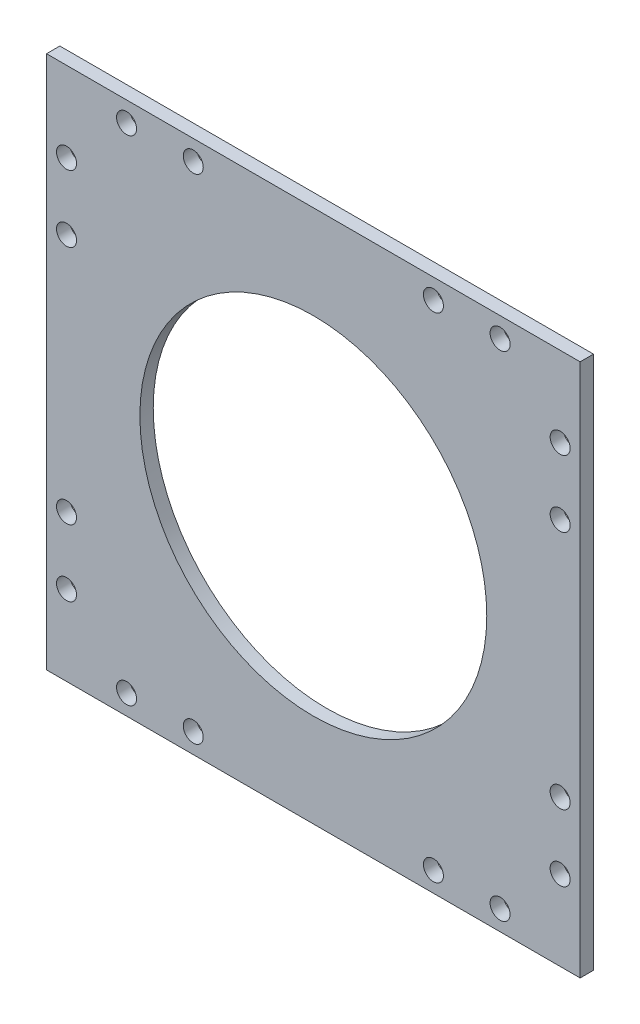
ISO-10303-21;
HEADER;
FILE_DESCRIPTION(('STEP AP214'),'2;1');
FILE_NAME('part.step','',(''),(''),'','','');
FILE_SCHEMA(('AUTOMOTIVE_DESIGN { 1 0 10303 214 1 1 1 1 }'));
ENDSEC;
DATA;
#1=APPLICATION_CONTEXT('core data for automotive mechanical design processes');
#2=APPLICATION_PROTOCOL_DEFINITION('international standard','automotive_design',2000,#1);
#3=PRODUCT_CONTEXT('',#1,'mechanical');
#4=PRODUCT('Part','Part','',(#3));
#5=PRODUCT_RELATED_PRODUCT_CATEGORY('part','',(#4));
#6=PRODUCT_DEFINITION_FORMATION('','',#4);
#7=PRODUCT_DEFINITION_CONTEXT('part definition',#1,'design');
#8=PRODUCT_DEFINITION('design','',#6,#7);
#9=PRODUCT_DEFINITION_SHAPE('','',#8);
#10=(LENGTH_UNIT() NAMED_UNIT(*) SI_UNIT(.MILLI.,.METRE.));
#11=(NAMED_UNIT(*) PLANE_ANGLE_UNIT() SI_UNIT($,.RADIAN.));
#12=(NAMED_UNIT(*) SI_UNIT($,.STERADIAN.) SOLID_ANGLE_UNIT());
#13=UNCERTAINTY_MEASURE_WITH_UNIT(LENGTH_MEASURE(1.E-05),#10,'distance_accuracy_value','');
#14=(GEOMETRIC_REPRESENTATION_CONTEXT(3) GLOBAL_UNCERTAINTY_ASSIGNED_CONTEXT((#13)) GLOBAL_UNIT_ASSIGNED_CONTEXT((#10,
#11,#12)) REPRESENTATION_CONTEXT('',''));
#15=CARTESIAN_POINT('',(0.,0.,0.));
#16=DIRECTION('',(0.,0.,1.));
#17=DIRECTION('',(1.,0.,0.));
#18=AXIS2_PLACEMENT_3D('',#15,#16,#17);
#19=CARTESIAN_POINT('',(0.,0.,2.));
#20=DIRECTION('',(0.,0.,1.));
#21=DIRECTION('',(1.,0.,0.));
#22=AXIS2_PLACEMENT_3D('',#19,#20,#21);
#23=PLANE('',#22);
#24=CARTESIAN_POINT('',(-28.,37.,2.));
#25=DIRECTION('',(0.,0.,1.));
#26=DIRECTION('',(1.,0.,0.));
#27=AXIS2_PLACEMENT_3D('',#24,#25,#26);
#28=CIRCLE('',#27,1.5);
#29=CARTESIAN_POINT('',(-26.5,37.,2.));
#30=VERTEX_POINT('',#29);
#31=EDGE_CURVE('E155',#30,#30,#28,.T.);
#32=ORIENTED_EDGE('',*,*,#31,.F.);
#33=EDGE_LOOP('',(#32));
#34=FACE_BOUND('',#33,.T.);
#35=CARTESIAN_POINT('',(-37.,28.,2.));
#36=DIRECTION('',(0.,0.,1.));
#37=DIRECTION('',(-1.,0.,0.));
#38=AXIS2_PLACEMENT_3D('',#35,#36,#37);
#39=CIRCLE('',#38,1.5);
#40=CARTESIAN_POINT('',(-38.5,28.,2.));
#41=VERTEX_POINT('',#40);
#42=EDGE_CURVE('E162',#41,#41,#39,.T.);
#43=ORIENTED_EDGE('',*,*,#42,.F.);
#44=EDGE_LOOP('',(#43));
#45=FACE_BOUND('',#44,.T.);
#46=CARTESIAN_POINT('',(-37.,18.,2.));
#47=DIRECTION('',(0.,0.,1.));
#48=DIRECTION('',(-1.,0.,0.));
#49=AXIS2_PLACEMENT_3D('',#46,#47,#48);
#50=CIRCLE('',#49,1.5);
#51=CARTESIAN_POINT('',(-38.5,18.,2.));
#52=VERTEX_POINT('',#51);
#53=EDGE_CURVE('E168',#52,#52,#50,.T.);
#54=ORIENTED_EDGE('',*,*,#53,.F.);
#55=EDGE_LOOP('',(#54));
#56=FACE_BOUND('',#55,.T.);
#57=CARTESIAN_POINT('',(-37.,-18.,2.));
#58=DIRECTION('',(0.,0.,1.));
#59=DIRECTION('',(-1.,0.,0.));
#60=AXIS2_PLACEMENT_3D('',#57,#58,#59);
#61=CIRCLE('',#60,1.5);
#62=CARTESIAN_POINT('',(-38.5,-18.,2.));
#63=VERTEX_POINT('',#62);
#64=EDGE_CURVE('E132',#63,#63,#61,.T.);
#65=ORIENTED_EDGE('',*,*,#64,.F.);
#66=EDGE_LOOP('',(#65));
#67=FACE_BOUND('',#66,.T.);
#68=CARTESIAN_POINT('',(-37.,-28.,2.));
#69=DIRECTION('',(0.,0.,1.));
#70=DIRECTION('',(-1.,0.,0.));
#71=AXIS2_PLACEMENT_3D('',#68,#69,#70);
#72=CIRCLE('',#71,1.5);
#73=CARTESIAN_POINT('',(-38.5,-28.,2.));
#74=VERTEX_POINT('',#73);
#75=EDGE_CURVE('E131',#74,#74,#72,.T.);
#76=ORIENTED_EDGE('',*,*,#75,.F.);
#77=EDGE_LOOP('',(#76));
#78=FACE_BOUND('',#77,.T.);
#79=CARTESIAN_POINT('',(37.,-28.,2.));
#80=DIRECTION('',(0.,0.,1.));
#81=DIRECTION('',(1.,0.,0.));
#82=AXIS2_PLACEMENT_3D('',#79,#80,#81);
#83=CIRCLE('',#82,1.5);
#84=CARTESIAN_POINT('',(38.5,-28.,2.));
#85=VERTEX_POINT('',#84);
#86=EDGE_CURVE('E138',#85,#85,#83,.T.);
#87=ORIENTED_EDGE('',*,*,#86,.F.);
#88=EDGE_LOOP('',(#87));
#89=FACE_BOUND('',#88,.T.);
#90=CARTESIAN_POINT('',(37.,-18.,2.));
#91=DIRECTION('',(0.,0.,1.));
#92=DIRECTION('',(1.,0.,0.));
#93=AXIS2_PLACEMENT_3D('',#90,#91,#92);
#94=CIRCLE('',#93,1.5);
#95=CARTESIAN_POINT('',(38.5,-18.,2.));
#96=VERTEX_POINT('',#95);
#97=EDGE_CURVE('E144',#96,#96,#94,.T.);
#98=ORIENTED_EDGE('',*,*,#97,.F.);
#99=EDGE_LOOP('',(#98));
#100=FACE_BOUND('',#99,.T.);
#101=CARTESIAN_POINT('',(37.,18.,2.));
#102=DIRECTION('',(0.,0.,1.));
#103=DIRECTION('',(1.,0.,0.));
#104=AXIS2_PLACEMENT_3D('',#101,#102,#103);
#105=CIRCLE('',#104,1.5);
#106=CARTESIAN_POINT('',(38.5,18.,2.));
#107=VERTEX_POINT('',#106);
#108=EDGE_CURVE('E125',#107,#107,#105,.T.);
#109=ORIENTED_EDGE('',*,*,#108,.F.);
#110=EDGE_LOOP('',(#109));
#111=FACE_BOUND('',#110,.T.);
#112=CARTESIAN_POINT('',(-28.,-37.,2.));
#113=DIRECTION('',(0.,0.,1.));
#114=DIRECTION('',(-1.,0.,0.));
#115=AXIS2_PLACEMENT_3D('',#112,#113,#114);
#116=CIRCLE('',#115,1.5);
#117=CARTESIAN_POINT('',(-29.5,-37.,2.));
#118=VERTEX_POINT('',#117);
#119=EDGE_CURVE('E203',#118,#118,#116,.T.);
#120=ORIENTED_EDGE('',*,*,#119,.F.);
#121=EDGE_LOOP('',(#120));
#122=FACE_BOUND('',#121,.T.);
#123=CARTESIAN_POINT('',(-18.,-37.,2.));
#124=DIRECTION('',(0.,0.,1.));
#125=DIRECTION('',(-1.,0.,0.));
#126=AXIS2_PLACEMENT_3D('',#123,#124,#125);
#127=CIRCLE('',#126,1.5);
#128=CARTESIAN_POINT('',(-19.5,-37.,2.));
#129=VERTEX_POINT('',#128);
#130=EDGE_CURVE('E209',#129,#129,#127,.T.);
#131=ORIENTED_EDGE('',*,*,#130,.F.);
#132=EDGE_LOOP('',(#131));
#133=FACE_BOUND('',#132,.T.);
#134=CARTESIAN_POINT('',(18.,-37.,2.));
#135=DIRECTION('',(0.,0.,1.));
#136=DIRECTION('',(-1.,0.,0.));
#137=AXIS2_PLACEMENT_3D('',#134,#135,#136);
#138=CIRCLE('',#137,1.49999999999999);
#139=CARTESIAN_POINT('',(16.5,-37.,2.));
#140=VERTEX_POINT('',#139);
#141=EDGE_CURVE('E180',#140,#140,#138,.T.);
#142=ORIENTED_EDGE('',*,*,#141,.F.);
#143=EDGE_LOOP('',(#142));
#144=FACE_BOUND('',#143,.T.);
#145=CARTESIAN_POINT('',(28.,-37.,2.));
#146=DIRECTION('',(0.,0.,1.));
#147=DIRECTION('',(-1.,0.,0.));
#148=AXIS2_PLACEMENT_3D('',#145,#146,#147);
#149=CIRCLE('',#148,1.5);
#150=CARTESIAN_POINT('',(26.5,-37.,2.));
#151=VERTEX_POINT('',#150);
#152=EDGE_CURVE('E179',#151,#151,#149,.T.);
#153=ORIENTED_EDGE('',*,*,#152,.F.);
#154=EDGE_LOOP('',(#153));
#155=FACE_BOUND('',#154,.T.);
#156=CARTESIAN_POINT('',(28.,37.,2.));
#157=DIRECTION('',(0.,0.,1.));
#158=DIRECTION('',(1.,0.,0.));
#159=AXIS2_PLACEMENT_3D('',#156,#157,#158);
#160=CIRCLE('',#159,1.5);
#161=CARTESIAN_POINT('',(29.5,37.,2.));
#162=VERTEX_POINT('',#161);
#163=EDGE_CURVE('E186',#162,#162,#160,.T.);
#164=ORIENTED_EDGE('',*,*,#163,.F.);
#165=EDGE_LOOP('',(#164));
#166=FACE_BOUND('',#165,.T.);
#167=CARTESIAN_POINT('',(18.,37.,2.));
#168=DIRECTION('',(0.,0.,1.));
#169=DIRECTION('',(1.,0.,0.));
#170=AXIS2_PLACEMENT_3D('',#167,#168,#169);
#171=CIRCLE('',#170,1.49999999999999);
#172=CARTESIAN_POINT('',(19.5,37.,2.));
#173=VERTEX_POINT('',#172);
#174=EDGE_CURVE('E192',#173,#173,#171,.T.);
#175=ORIENTED_EDGE('',*,*,#174,.F.);
#176=EDGE_LOOP('',(#175));
#177=FACE_BOUND('',#176,.T.);
#178=CARTESIAN_POINT('',(-18.,37.,2.));
#179=DIRECTION('',(0.,0.,1.));
#180=DIRECTION('',(1.,0.,0.));
#181=AXIS2_PLACEMENT_3D('',#178,#179,#180);
#182=CIRCLE('',#181,1.5);
#183=CARTESIAN_POINT('',(-16.5,37.,2.));
#184=VERTEX_POINT('',#183);
#185=EDGE_CURVE('E156',#184,#184,#182,.T.);
#186=ORIENTED_EDGE('',*,*,#185,.F.);
#187=EDGE_LOOP('',(#186));
#188=FACE_BOUND('',#187,.T.);
#189=CARTESIAN_POINT('',(37.,28.,2.));
#190=DIRECTION('',(0.,0.,1.));
#191=DIRECTION('',(1.,0.,0.));
#192=AXIS2_PLACEMENT_3D('',#189,#190,#191);
#193=CIRCLE('',#192,1.5);
#194=CARTESIAN_POINT('',(38.5,28.,2.));
#195=VERTEX_POINT('',#194);
#196=EDGE_CURVE('E122',#195,#195,#193,.T.);
#197=ORIENTED_EDGE('',*,*,#196,.F.);
#198=EDGE_LOOP('',(#197));
#199=FACE_BOUND('',#198,.T.);
#200=DIRECTION('',(0.,1.,0.));
#201=VECTOR('',#200,1.);
#202=CARTESIAN_POINT('',(40.,40.,2.));
#203=LINE('',#202,#201);
#204=CARTESIAN_POINT('',(40.,-40.,2.));
#205=VERTEX_POINT('',#204);
#206=CARTESIAN_POINT('',(40.,40.,2.));
#207=VERTEX_POINT('',#206);
#208=EDGE_CURVE('E89',#205,#207,#203,.T.);
#209=ORIENTED_EDGE('',*,*,#208,.T.);
#210=DIRECTION('',(-1.,0.,0.));
#211=VECTOR('',#210,1.);
#212=CARTESIAN_POINT('',(-40.,40.,2.));
#213=LINE('',#212,#211);
#214=CARTESIAN_POINT('',(-40.,40.,2.));
#215=VERTEX_POINT('',#214);
#216=EDGE_CURVE('E84',#207,#215,#213,.T.);
#217=ORIENTED_EDGE('',*,*,#216,.T.);
#218=DIRECTION('',(0.,-1.,0.));
#219=VECTOR('',#218,1.);
#220=CARTESIAN_POINT('',(-40.,40.,2.));
#221=LINE('',#220,#219);
#222=CARTESIAN_POINT('',(-40.,-40.,2.));
#223=VERTEX_POINT('',#222);
#224=EDGE_CURVE('E87',#215,#223,#221,.T.);
#225=ORIENTED_EDGE('',*,*,#224,.T.);
#226=DIRECTION('',(1.,0.,0.));
#227=VECTOR('',#226,1.);
#228=CARTESIAN_POINT('',(-40.,-40.,2.));
#229=LINE('',#228,#227);
#230=EDGE_CURVE('E54',#223,#205,#229,.T.);
#231=ORIENTED_EDGE('',*,*,#230,.T.);
#232=EDGE_LOOP('',(#209,#217,#225,#231));
#233=FACE_BOUND('',#232,.T.);
#234=CARTESIAN_POINT('',(0.,0.,2.));
#235=DIRECTION('',(0.,0.,1.));
#236=DIRECTION('',(1.,0.,0.));
#237=AXIS2_PLACEMENT_3D('',#234,#235,#236);
#238=CIRCLE('',#237,26.);
#239=CARTESIAN_POINT('',(26.,0.,2.));
#240=VERTEX_POINT('',#239);
#241=EDGE_CURVE('E104',#240,#240,#238,.T.);
#242=ORIENTED_EDGE('',*,*,#241,.F.);
#243=EDGE_LOOP('',(#242));
#244=FACE_BOUND('',#243,.T.);
#245=ADVANCED_FACE('F37',(#34,#45,#56,#67,#78,#89,#100,#111,#122,#133,#144,#155,#166,#177,#188,
#199,#233,#244),#23,.T.);
#246=CARTESIAN_POINT('',(0.,0.,0.));
#247=DIRECTION('',(0.,0.,1.));
#248=DIRECTION('',(1.,0.,0.));
#249=AXIS2_PLACEMENT_3D('',#246,#247,#248);
#250=PLANE('',#249);
#251=CARTESIAN_POINT('',(-28.,37.,0.));
#252=DIRECTION('',(0.,0.,1.));
#253=DIRECTION('',(1.,0.,0.));
#254=AXIS2_PLACEMENT_3D('',#251,#252,#253);
#255=CIRCLE('',#254,1.5);
#256=CARTESIAN_POINT('',(-26.5,37.,0.));
#257=VERTEX_POINT('',#256);
#258=EDGE_CURVE('E152',#257,#257,#255,.T.);
#259=ORIENTED_EDGE('',*,*,#258,.T.);
#260=EDGE_LOOP('',(#259));
#261=FACE_BOUND('',#260,.T.);
#262=CARTESIAN_POINT('',(-37.,28.,0.));
#263=DIRECTION('',(0.,0.,1.));
#264=DIRECTION('',(-1.,0.,0.));
#265=AXIS2_PLACEMENT_3D('',#262,#263,#264);
#266=CIRCLE('',#265,1.5);
#267=CARTESIAN_POINT('',(-38.5,28.,0.));
#268=VERTEX_POINT('',#267);
#269=EDGE_CURVE('E159',#268,#268,#266,.T.);
#270=ORIENTED_EDGE('',*,*,#269,.T.);
#271=EDGE_LOOP('',(#270));
#272=FACE_BOUND('',#271,.T.);
#273=CARTESIAN_POINT('',(-37.,18.,0.));
#274=DIRECTION('',(0.,0.,1.));
#275=DIRECTION('',(-1.,0.,0.));
#276=AXIS2_PLACEMENT_3D('',#273,#274,#275);
#277=CIRCLE('',#276,1.5);
#278=CARTESIAN_POINT('',(-38.5,18.,0.));
#279=VERTEX_POINT('',#278);
#280=EDGE_CURVE('E165',#279,#279,#277,.T.);
#281=ORIENTED_EDGE('',*,*,#280,.T.);
#282=EDGE_LOOP('',(#281));
#283=FACE_BOUND('',#282,.T.);
#284=CARTESIAN_POINT('',(-37.,-18.,0.));
#285=DIRECTION('',(0.,0.,1.));
#286=DIRECTION('',(-1.,0.,0.));
#287=AXIS2_PLACEMENT_3D('',#284,#285,#286);
#288=CIRCLE('',#287,1.5);
#289=CARTESIAN_POINT('',(-38.5,-18.,0.));
#290=VERTEX_POINT('',#289);
#291=EDGE_CURVE('E171',#290,#290,#288,.T.);
#292=ORIENTED_EDGE('',*,*,#291,.T.);
#293=EDGE_LOOP('',(#292));
#294=FACE_BOUND('',#293,.T.);
#295=CARTESIAN_POINT('',(-37.,-28.,0.));
#296=DIRECTION('',(0.,0.,1.));
#297=DIRECTION('',(-1.,0.,0.));
#298=AXIS2_PLACEMENT_3D('',#295,#296,#297);
#299=CIRCLE('',#298,1.5);
#300=CARTESIAN_POINT('',(-38.5,-28.,0.));
#301=VERTEX_POINT('',#300);
#302=EDGE_CURVE('E128',#301,#301,#299,.T.);
#303=ORIENTED_EDGE('',*,*,#302,.T.);
#304=EDGE_LOOP('',(#303));
#305=FACE_BOUND('',#304,.T.);
#306=CARTESIAN_POINT('',(37.,-28.,0.));
#307=DIRECTION('',(0.,0.,1.));
#308=DIRECTION('',(1.,0.,0.));
#309=AXIS2_PLACEMENT_3D('',#306,#307,#308);
#310=CIRCLE('',#309,1.5);
#311=CARTESIAN_POINT('',(38.5,-28.,0.));
#312=VERTEX_POINT('',#311);
#313=EDGE_CURVE('E135',#312,#312,#310,.T.);
#314=ORIENTED_EDGE('',*,*,#313,.T.);
#315=EDGE_LOOP('',(#314));
#316=FACE_BOUND('',#315,.T.);
#317=CARTESIAN_POINT('',(37.,-18.,0.));
#318=DIRECTION('',(0.,0.,1.));
#319=DIRECTION('',(1.,0.,0.));
#320=AXIS2_PLACEMENT_3D('',#317,#318,#319);
#321=CIRCLE('',#320,1.5);
#322=CARTESIAN_POINT('',(38.5,-18.,0.));
#323=VERTEX_POINT('',#322);
#324=EDGE_CURVE('E141',#323,#323,#321,.T.);
#325=ORIENTED_EDGE('',*,*,#324,.T.);
#326=EDGE_LOOP('',(#325));
#327=FACE_BOUND('',#326,.T.);
#328=CARTESIAN_POINT('',(37.,18.,0.));
#329=DIRECTION('',(0.,0.,1.));
#330=DIRECTION('',(1.,0.,0.));
#331=AXIS2_PLACEMENT_3D('',#328,#329,#330);
#332=CIRCLE('',#331,1.5);
#333=CARTESIAN_POINT('',(38.5,18.,0.));
#334=VERTEX_POINT('',#333);
#335=EDGE_CURVE('E147',#334,#334,#332,.T.);
#336=ORIENTED_EDGE('',*,*,#335,.T.);
#337=EDGE_LOOP('',(#336));
#338=FACE_BOUND('',#337,.T.);
#339=CARTESIAN_POINT('',(-28.,-37.,0.));
#340=DIRECTION('',(0.,0.,1.));
#341=DIRECTION('',(-1.,0.,0.));
#342=AXIS2_PLACEMENT_3D('',#339,#340,#341);
#343=CIRCLE('',#342,1.5);
#344=CARTESIAN_POINT('',(-29.5,-37.,0.));
#345=VERTEX_POINT('',#344);
#346=EDGE_CURVE('E200',#345,#345,#343,.T.);
#347=ORIENTED_EDGE('',*,*,#346,.T.);
#348=EDGE_LOOP('',(#347));
#349=FACE_BOUND('',#348,.T.);
#350=CARTESIAN_POINT('',(-18.,-37.,0.));
#351=DIRECTION('',(0.,0.,1.));
#352=DIRECTION('',(-1.,0.,0.));
#353=AXIS2_PLACEMENT_3D('',#350,#351,#352);
#354=CIRCLE('',#353,1.5);
#355=CARTESIAN_POINT('',(-19.5,-37.,0.));
#356=VERTEX_POINT('',#355);
#357=EDGE_CURVE('E206',#356,#356,#354,.T.);
#358=ORIENTED_EDGE('',*,*,#357,.T.);
#359=EDGE_LOOP('',(#358));
#360=FACE_BOUND('',#359,.T.);
#361=CARTESIAN_POINT('',(18.,-37.,0.));
#362=DIRECTION('',(0.,0.,1.));
#363=DIRECTION('',(-1.,0.,0.));
#364=AXIS2_PLACEMENT_3D('',#361,#362,#363);
#365=CIRCLE('',#364,1.49999999999999);
#366=CARTESIAN_POINT('',(16.5,-37.,0.));
#367=VERTEX_POINT('',#366);
#368=EDGE_CURVE('E212',#367,#367,#365,.T.);
#369=ORIENTED_EDGE('',*,*,#368,.T.);
#370=EDGE_LOOP('',(#369));
#371=FACE_BOUND('',#370,.T.);
#372=CARTESIAN_POINT('',(28.,-37.,0.));
#373=DIRECTION('',(0.,0.,1.));
#374=DIRECTION('',(-1.,0.,0.));
#375=AXIS2_PLACEMENT_3D('',#372,#373,#374);
#376=CIRCLE('',#375,1.5);
#377=CARTESIAN_POINT('',(26.5,-37.,0.));
#378=VERTEX_POINT('',#377);
#379=EDGE_CURVE('E176',#378,#378,#376,.T.);
#380=ORIENTED_EDGE('',*,*,#379,.T.);
#381=EDGE_LOOP('',(#380));
#382=FACE_BOUND('',#381,.T.);
#383=CARTESIAN_POINT('',(28.,37.,0.));
#384=DIRECTION('',(0.,0.,1.));
#385=DIRECTION('',(1.,0.,0.));
#386=AXIS2_PLACEMENT_3D('',#383,#384,#385);
#387=CIRCLE('',#386,1.5);
#388=CARTESIAN_POINT('',(29.5,37.,0.));
#389=VERTEX_POINT('',#388);
#390=EDGE_CURVE('E183',#389,#389,#387,.T.);
#391=ORIENTED_EDGE('',*,*,#390,.T.);
#392=EDGE_LOOP('',(#391));
#393=FACE_BOUND('',#392,.T.);
#394=CARTESIAN_POINT('',(18.,37.,0.));
#395=DIRECTION('',(0.,0.,1.));
#396=DIRECTION('',(1.,0.,0.));
#397=AXIS2_PLACEMENT_3D('',#394,#395,#396);
#398=CIRCLE('',#397,1.49999999999999);
#399=CARTESIAN_POINT('',(19.5,37.,0.));
#400=VERTEX_POINT('',#399);
#401=EDGE_CURVE('E189',#400,#400,#398,.T.);
#402=ORIENTED_EDGE('',*,*,#401,.T.);
#403=EDGE_LOOP('',(#402));
#404=FACE_BOUND('',#403,.T.);
#405=CARTESIAN_POINT('',(-18.,37.,0.));
#406=DIRECTION('',(0.,0.,1.));
#407=DIRECTION('',(1.,0.,0.));
#408=AXIS2_PLACEMENT_3D('',#405,#406,#407);
#409=CIRCLE('',#408,1.5);
#410=CARTESIAN_POINT('',(-16.5,37.,0.));
#411=VERTEX_POINT('',#410);
#412=EDGE_CURVE('E195',#411,#411,#409,.T.);
#413=ORIENTED_EDGE('',*,*,#412,.T.);
#414=EDGE_LOOP('',(#413));
#415=FACE_BOUND('',#414,.T.);
#416=CARTESIAN_POINT('',(37.,28.,0.));
#417=DIRECTION('',(0.,0.,1.));
#418=DIRECTION('',(1.,0.,0.));
#419=AXIS2_PLACEMENT_3D('',#416,#417,#418);
#420=CIRCLE('',#419,1.5);
#421=CARTESIAN_POINT('',(38.5,28.,0.));
#422=VERTEX_POINT('',#421);
#423=EDGE_CURVE('E119',#422,#422,#420,.T.);
#424=ORIENTED_EDGE('',*,*,#423,.T.);
#425=EDGE_LOOP('',(#424));
#426=FACE_BOUND('',#425,.T.);
#427=DIRECTION('',(0.,1.,0.));
#428=VECTOR('',#427,1.);
#429=CARTESIAN_POINT('',(40.,40.,0.));
#430=LINE('',#429,#428);
#431=CARTESIAN_POINT('',(40.,-40.,0.));
#432=VERTEX_POINT('',#431);
#433=CARTESIAN_POINT('',(40.,40.,0.));
#434=VERTEX_POINT('',#433);
#435=EDGE_CURVE('E101',#432,#434,#430,.T.);
#436=ORIENTED_EDGE('',*,*,#435,.F.);
#437=DIRECTION('',(1.,0.,0.));
#438=VECTOR('',#437,1.);
#439=CARTESIAN_POINT('',(-40.,-40.,0.));
#440=LINE('',#439,#438);
#441=CARTESIAN_POINT('',(-40.,-40.,0.));
#442=VERTEX_POINT('',#441);
#443=EDGE_CURVE('E77',#442,#432,#440,.T.);
#444=ORIENTED_EDGE('',*,*,#443,.F.);
#445=DIRECTION('',(0.,-1.,0.));
#446=VECTOR('',#445,1.);
#447=CARTESIAN_POINT('',(-40.,40.,0.));
#448=LINE('',#447,#446);
#449=CARTESIAN_POINT('',(-40.,40.,0.));
#450=VERTEX_POINT('',#449);
#451=EDGE_CURVE('E71',#450,#442,#448,.T.);
#452=ORIENTED_EDGE('',*,*,#451,.F.);
#453=DIRECTION('',(-1.,0.,0.));
#454=VECTOR('',#453,1.);
#455=CARTESIAN_POINT('',(-40.,40.,0.));
#456=LINE('',#455,#454);
#457=EDGE_CURVE('E93',#434,#450,#456,.T.);
#458=ORIENTED_EDGE('',*,*,#457,.F.);
#459=EDGE_LOOP('',(#436,#444,#452,#458));
#460=FACE_BOUND('',#459,.T.);
#461=CARTESIAN_POINT('',(0.,0.,0.));
#462=DIRECTION('',(0.,0.,1.));
#463=DIRECTION('',(1.,0.,0.));
#464=AXIS2_PLACEMENT_3D('',#461,#462,#463);
#465=CIRCLE('',#464,26.);
#466=CARTESIAN_POINT('',(26.,0.,0.));
#467=VERTEX_POINT('',#466);
#468=EDGE_CURVE('E116',#467,#467,#465,.T.);
#469=ORIENTED_EDGE('',*,*,#468,.T.);
#470=EDGE_LOOP('',(#469));
#471=FACE_BOUND('',#470,.T.);
#472=ADVANCED_FACE('F112',(#261,#272,#283,#294,#305,#316,#327,#338,#349,#360,#371,#382,#393,
#404,#415,#426,#460,#471),#250,.F.);
#473=CARTESIAN_POINT('',(40.,40.,2.));
#474=DIRECTION('',(-1.,0.,0.));
#475=DIRECTION('',(0.,-1.,0.));
#476=AXIS2_PLACEMENT_3D('',#473,#474,#475);
#477=PLANE('',#476);
#478=ORIENTED_EDGE('',*,*,#435,.T.);
#479=DIRECTION('',(0.,0.,-1.));
#480=VECTOR('',#479,1.);
#481=CARTESIAN_POINT('',(40.,40.,2.));
#482=LINE('',#481,#480);
#483=EDGE_CURVE('E11',#207,#434,#482,.T.);
#484=ORIENTED_EDGE('',*,*,#483,.F.);
#485=ORIENTED_EDGE('',*,*,#208,.F.);
#486=DIRECTION('',(0.,0.,-1.));
#487=VECTOR('',#486,1.);
#488=CARTESIAN_POINT('',(40.,-40.,2.));
#489=LINE('',#488,#487);
#490=EDGE_CURVE('E97',#205,#432,#489,.T.);
#491=ORIENTED_EDGE('',*,*,#490,.T.);
#492=EDGE_LOOP('',(#478,#484,#485,#491));
#493=FACE_BOUND('',#492,.T.);
#494=ADVANCED_FACE('F39',(#493),#477,.F.);
#495=CARTESIAN_POINT('',(-40.,40.,2.));
#496=DIRECTION('',(0.,-1.,0.));
#497=DIRECTION('',(0.,0.,-1.));
#498=AXIS2_PLACEMENT_3D('',#495,#496,#497);
#499=PLANE('',#498);
#500=ORIENTED_EDGE('',*,*,#457,.T.);
#501=DIRECTION('',(0.,0.,-1.));
#502=VECTOR('',#501,1.);
#503=CARTESIAN_POINT('',(-40.,40.,2.));
#504=LINE('',#503,#502);
#505=EDGE_CURVE('E46',#215,#450,#504,.T.);
#506=ORIENTED_EDGE('',*,*,#505,.F.);
#507=ORIENTED_EDGE('',*,*,#216,.F.);
#508=ORIENTED_EDGE('',*,*,#483,.T.);
#509=EDGE_LOOP('',(#500,#506,#507,#508));
#510=FACE_BOUND('',#509,.T.);
#511=ADVANCED_FACE('F92',(#510),#499,.F.);
#512=CARTESIAN_POINT('',(-40.,40.,2.));
#513=DIRECTION('',(1.,0.,0.));
#514=DIRECTION('',(0.,1.,0.));
#515=AXIS2_PLACEMENT_3D('',#512,#513,#514);
#516=PLANE('',#515);
#517=ORIENTED_EDGE('',*,*,#451,.T.);
#518=DIRECTION('',(0.,0.,-1.));
#519=VECTOR('',#518,1.);
#520=CARTESIAN_POINT('',(-40.,-40.,2.));
#521=LINE('',#520,#519);
#522=EDGE_CURVE('E94',#223,#442,#521,.T.);
#523=ORIENTED_EDGE('',*,*,#522,.F.);
#524=ORIENTED_EDGE('',*,*,#224,.F.);
#525=ORIENTED_EDGE('',*,*,#505,.T.);
#526=EDGE_LOOP('',(#517,#523,#524,#525));
#527=FACE_BOUND('',#526,.T.);
#528=ADVANCED_FACE('F95',(#527),#516,.F.);
#529=CARTESIAN_POINT('',(-40.,-40.,2.));
#530=DIRECTION('',(0.,1.,0.));
#531=DIRECTION('',(0.,0.,1.));
#532=AXIS2_PLACEMENT_3D('',#529,#530,#531);
#533=PLANE('',#532);
#534=ORIENTED_EDGE('',*,*,#443,.T.);
#535=ORIENTED_EDGE('',*,*,#490,.F.);
#536=ORIENTED_EDGE('',*,*,#230,.F.);
#537=ORIENTED_EDGE('',*,*,#522,.T.);
#538=EDGE_LOOP('',(#534,#535,#536,#537));
#539=FACE_BOUND('',#538,.T.);
#540=ADVANCED_FACE('F109',(#539),#533,.F.);
#541=CARTESIAN_POINT('',(0.,0.,2.));
#542=DIRECTION('',(0.,0.,-1.));
#543=DIRECTION('',(-1.,0.,0.));
#544=AXIS2_PLACEMENT_3D('',#541,#542,#543);
#545=CYLINDRICAL_SURFACE('',#544,26.);
#546=ORIENTED_EDGE('',*,*,#241,.T.);
#547=EDGE_LOOP('',(#546));
#548=FACE_BOUND('',#547,.T.);
#549=ORIENTED_EDGE('',*,*,#468,.F.);
#550=EDGE_LOOP('',(#549));
#551=FACE_BOUND('',#550,.T.);
#552=ADVANCED_FACE('F237',(#548,#551),#545,.F.);
#553=CARTESIAN_POINT('',(37.,28.,0.));
#554=DIRECTION('',(0.,0.,1.));
#555=DIRECTION('',(1.,0.,0.));
#556=AXIS2_PLACEMENT_3D('',#553,#554,#555);
#557=CYLINDRICAL_SURFACE('',#556,1.5);
#558=ORIENTED_EDGE('',*,*,#423,.F.);
#559=EDGE_LOOP('',(#558));
#560=FACE_BOUND('',#559,.T.);
#561=ORIENTED_EDGE('',*,*,#196,.T.);
#562=EDGE_LOOP('',(#561));
#563=FACE_BOUND('',#562,.T.);
#564=ADVANCED_FACE('F234',(#560,#563),#557,.F.);
#565=CARTESIAN_POINT('',(-18.,37.,0.));
#566=DIRECTION('',(0.,0.,1.));
#567=DIRECTION('',(1.,0.,0.));
#568=AXIS2_PLACEMENT_3D('',#565,#566,#567);
#569=CYLINDRICAL_SURFACE('',#568,1.5);
#570=ORIENTED_EDGE('',*,*,#412,.F.);
#571=EDGE_LOOP('',(#570));
#572=FACE_BOUND('',#571,.T.);
#573=ORIENTED_EDGE('',*,*,#185,.T.);
#574=EDGE_LOOP('',(#573));
#575=FACE_BOUND('',#574,.T.);
#576=ADVANCED_FACE('F236',(#572,#575),#569,.F.);
#577=CARTESIAN_POINT('',(18.,37.,0.));
#578=DIRECTION('',(0.,0.,1.));
#579=DIRECTION('',(1.,0.,0.));
#580=AXIS2_PLACEMENT_3D('',#577,#578,#579);
#581=CYLINDRICAL_SURFACE('',#580,1.49999999999999);
#582=ORIENTED_EDGE('',*,*,#401,.F.);
#583=EDGE_LOOP('',(#582));
#584=FACE_BOUND('',#583,.T.);
#585=ORIENTED_EDGE('',*,*,#174,.T.);
#586=EDGE_LOOP('',(#585));
#587=FACE_BOUND('',#586,.T.);
#588=ADVANCED_FACE('F244',(#584,#587),#581,.F.);
#589=CARTESIAN_POINT('',(28.,37.,0.));
#590=DIRECTION('',(0.,0.,1.));
#591=DIRECTION('',(1.,0.,0.));
#592=AXIS2_PLACEMENT_3D('',#589,#590,#591);
#593=CYLINDRICAL_SURFACE('',#592,1.5);
#594=ORIENTED_EDGE('',*,*,#390,.F.);
#595=EDGE_LOOP('',(#594));
#596=FACE_BOUND('',#595,.T.);
#597=ORIENTED_EDGE('',*,*,#163,.T.);
#598=EDGE_LOOP('',(#597));
#599=FACE_BOUND('',#598,.T.);
#600=ADVANCED_FACE('F334',(#596,#599),#593,.F.);
#601=CARTESIAN_POINT('',(28.,-37.,0.));
#602=DIRECTION('',(0.,0.,1.));
#603=DIRECTION('',(1.,0.,0.));
#604=AXIS2_PLACEMENT_3D('',#601,#602,#603);
#605=CYLINDRICAL_SURFACE('',#604,1.5);
#606=ORIENTED_EDGE('',*,*,#379,.F.);
#607=EDGE_LOOP('',(#606));
#608=FACE_BOUND('',#607,.T.);
#609=ORIENTED_EDGE('',*,*,#152,.T.);
#610=EDGE_LOOP('',(#609));
#611=FACE_BOUND('',#610,.T.);
#612=ADVANCED_FACE('F344',(#608,#611),#605,.F.);
#613=CARTESIAN_POINT('',(18.,-37.,0.));
#614=DIRECTION('',(0.,0.,1.));
#615=DIRECTION('',(1.,0.,0.));
#616=AXIS2_PLACEMENT_3D('',#613,#614,#615);
#617=CYLINDRICAL_SURFACE('',#616,1.49999999999999);
#618=ORIENTED_EDGE('',*,*,#368,.F.);
#619=EDGE_LOOP('',(#618));
#620=FACE_BOUND('',#619,.T.);
#621=ORIENTED_EDGE('',*,*,#141,.T.);
#622=EDGE_LOOP('',(#621));
#623=FACE_BOUND('',#622,.T.);
#624=ADVANCED_FACE('F218',(#620,#623),#617,.F.);
#625=CARTESIAN_POINT('',(-18.,-37.,0.));
#626=DIRECTION('',(0.,0.,1.));
#627=DIRECTION('',(1.,0.,0.));
#628=AXIS2_PLACEMENT_3D('',#625,#626,#627);
#629=CYLINDRICAL_SURFACE('',#628,1.5);
#630=ORIENTED_EDGE('',*,*,#357,.F.);
#631=EDGE_LOOP('',(#630));
#632=FACE_BOUND('',#631,.T.);
#633=ORIENTED_EDGE('',*,*,#130,.T.);
#634=EDGE_LOOP('',(#633));
#635=FACE_BOUND('',#634,.T.);
#636=ADVANCED_FACE('F363',(#632,#635),#629,.F.);
#637=CARTESIAN_POINT('',(-28.,-37.,0.));
#638=DIRECTION('',(0.,0.,1.));
#639=DIRECTION('',(1.,0.,0.));
#640=AXIS2_PLACEMENT_3D('',#637,#638,#639);
#641=CYLINDRICAL_SURFACE('',#640,1.5);
#642=ORIENTED_EDGE('',*,*,#346,.F.);
#643=EDGE_LOOP('',(#642));
#644=FACE_BOUND('',#643,.T.);
#645=ORIENTED_EDGE('',*,*,#119,.T.);
#646=EDGE_LOOP('',(#645));
#647=FACE_BOUND('',#646,.T.);
#648=ADVANCED_FACE('F373',(#644,#647),#641,.F.);
#649=CARTESIAN_POINT('',(37.,18.,0.));
#650=DIRECTION('',(0.,0.,1.));
#651=DIRECTION('',(1.,0.,0.));
#652=AXIS2_PLACEMENT_3D('',#649,#650,#651);
#653=CYLINDRICAL_SURFACE('',#652,1.5);
#654=ORIENTED_EDGE('',*,*,#335,.F.);
#655=EDGE_LOOP('',(#654));
#656=FACE_BOUND('',#655,.T.);
#657=ORIENTED_EDGE('',*,*,#108,.T.);
#658=EDGE_LOOP('',(#657));
#659=FACE_BOUND('',#658,.T.);
#660=ADVANCED_FACE('F383',(#656,#659),#653,.F.);
#661=CARTESIAN_POINT('',(37.,-18.,0.));
#662=DIRECTION('',(0.,0.,1.));
#663=DIRECTION('',(1.,0.,0.));
#664=AXIS2_PLACEMENT_3D('',#661,#662,#663);
#665=CYLINDRICAL_SURFACE('',#664,1.5);
#666=ORIENTED_EDGE('',*,*,#324,.F.);
#667=EDGE_LOOP('',(#666));
#668=FACE_BOUND('',#667,.T.);
#669=ORIENTED_EDGE('',*,*,#97,.T.);
#670=EDGE_LOOP('',(#669));
#671=FACE_BOUND('',#670,.T.);
#672=ADVANCED_FACE('F393',(#668,#671),#665,.F.);
#673=CARTESIAN_POINT('',(37.,-28.,0.));
#674=DIRECTION('',(0.,0.,1.));
#675=DIRECTION('',(1.,0.,0.));
#676=AXIS2_PLACEMENT_3D('',#673,#674,#675);
#677=CYLINDRICAL_SURFACE('',#676,1.5);
#678=ORIENTED_EDGE('',*,*,#313,.F.);
#679=EDGE_LOOP('',(#678));
#680=FACE_BOUND('',#679,.T.);
#681=ORIENTED_EDGE('',*,*,#86,.T.);
#682=EDGE_LOOP('',(#681));
#683=FACE_BOUND('',#682,.T.);
#684=ADVANCED_FACE('F403',(#680,#683),#677,.F.);
#685=CARTESIAN_POINT('',(-37.,-28.,0.));
#686=DIRECTION('',(0.,0.,1.));
#687=DIRECTION('',(1.,0.,0.));
#688=AXIS2_PLACEMENT_3D('',#685,#686,#687);
#689=CYLINDRICAL_SURFACE('',#688,1.5);
#690=ORIENTED_EDGE('',*,*,#302,.F.);
#691=EDGE_LOOP('',(#690));
#692=FACE_BOUND('',#691,.T.);
#693=ORIENTED_EDGE('',*,*,#75,.T.);
#694=EDGE_LOOP('',(#693));
#695=FACE_BOUND('',#694,.T.);
#696=ADVANCED_FACE('F251',(#692,#695),#689,.F.);
#697=CARTESIAN_POINT('',(-37.,-18.,0.));
#698=DIRECTION('',(0.,0.,1.));
#699=DIRECTION('',(1.,0.,0.));
#700=AXIS2_PLACEMENT_3D('',#697,#698,#699);
#701=CYLINDRICAL_SURFACE('',#700,1.5);
#702=ORIENTED_EDGE('',*,*,#291,.F.);
#703=EDGE_LOOP('',(#702));
#704=FACE_BOUND('',#703,.T.);
#705=ORIENTED_EDGE('',*,*,#64,.T.);
#706=EDGE_LOOP('',(#705));
#707=FACE_BOUND('',#706,.T.);
#708=ADVANCED_FACE('F421',(#704,#707),#701,.F.);
#709=CARTESIAN_POINT('',(-37.,18.,0.));
#710=DIRECTION('',(0.,0.,1.));
#711=DIRECTION('',(1.,0.,0.));
#712=AXIS2_PLACEMENT_3D('',#709,#710,#711);
#713=CYLINDRICAL_SURFACE('',#712,1.5);
#714=ORIENTED_EDGE('',*,*,#280,.F.);
#715=EDGE_LOOP('',(#714));
#716=FACE_BOUND('',#715,.T.);
#717=ORIENTED_EDGE('',*,*,#53,.T.);
#718=EDGE_LOOP('',(#717));
#719=FACE_BOUND('',#718,.T.);
#720=ADVANCED_FACE('F430',(#716,#719),#713,.F.);
#721=CARTESIAN_POINT('',(-37.,28.,0.));
#722=DIRECTION('',(0.,0.,1.));
#723=DIRECTION('',(1.,0.,0.));
#724=AXIS2_PLACEMENT_3D('',#721,#722,#723);
#725=CYLINDRICAL_SURFACE('',#724,1.5);
#726=ORIENTED_EDGE('',*,*,#269,.F.);
#727=EDGE_LOOP('',(#726));
#728=FACE_BOUND('',#727,.T.);
#729=ORIENTED_EDGE('',*,*,#42,.T.);
#730=EDGE_LOOP('',(#729));
#731=FACE_BOUND('',#730,.T.);
#732=ADVANCED_FACE('F440',(#728,#731),#725,.F.);
#733=CARTESIAN_POINT('',(-28.,37.,0.));
#734=DIRECTION('',(0.,0.,1.));
#735=DIRECTION('',(1.,0.,0.));
#736=AXIS2_PLACEMENT_3D('',#733,#734,#735);
#737=CYLINDRICAL_SURFACE('',#736,1.5);
#738=ORIENTED_EDGE('',*,*,#258,.F.);
#739=EDGE_LOOP('',(#738));
#740=FACE_BOUND('',#739,.T.);
#741=ORIENTED_EDGE('',*,*,#31,.T.);
#742=EDGE_LOOP('',(#741));
#743=FACE_BOUND('',#742,.T.);
#744=ADVANCED_FACE('F450',(#740,#743),#737,.F.);
#745=CLOSED_SHELL('',(#245,#472,#494,#511,#528,#540,#552,#564,#576,#588,#600,#612,#624,#636,
#648,#660,#672,#684,#696,#708,#720,#732,#744));
#746=MANIFOLD_SOLID_BREP('B2',#745);
#747=ADVANCED_BREP_SHAPE_REPRESENTATION('',(#18,#746),#14);
#748=SHAPE_DEFINITION_REPRESENTATION(#9,#747);
ENDSEC;
END-ISO-10303-21;
